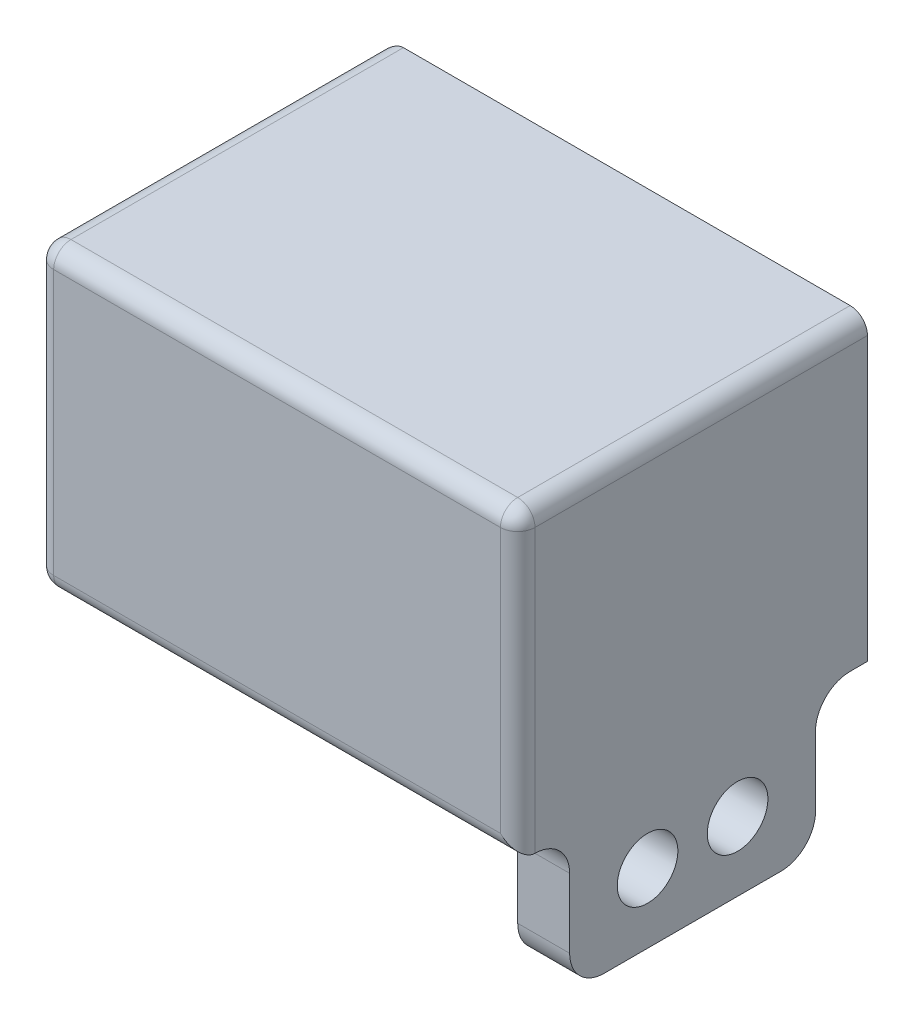
ISO-10303-21;
HEADER;
FILE_DESCRIPTION(('STEP AP214'),'2;1');
FILE_NAME('part.step','',(''),(''),'','','');
FILE_SCHEMA(('AUTOMOTIVE_DESIGN { 1 0 10303 214 1 1 1 1 }'));
ENDSEC;
DATA;
#1=APPLICATION_CONTEXT('core data for automotive mechanical design processes');
#2=APPLICATION_PROTOCOL_DEFINITION('international standard','automotive_design',2000,#1);
#3=PRODUCT_CONTEXT('',#1,'mechanical');
#4=PRODUCT('Part','Part','',(#3));
#5=PRODUCT_RELATED_PRODUCT_CATEGORY('part','',(#4));
#6=PRODUCT_DEFINITION_FORMATION('','',#4);
#7=PRODUCT_DEFINITION_CONTEXT('part definition',#1,'design');
#8=PRODUCT_DEFINITION('design','',#6,#7);
#9=PRODUCT_DEFINITION_SHAPE('','',#8);
#10=(LENGTH_UNIT() NAMED_UNIT(*) SI_UNIT(.MILLI.,.METRE.));
#11=(NAMED_UNIT(*) PLANE_ANGLE_UNIT() SI_UNIT($,.RADIAN.));
#12=(NAMED_UNIT(*) SI_UNIT($,.STERADIAN.) SOLID_ANGLE_UNIT());
#13=UNCERTAINTY_MEASURE_WITH_UNIT(LENGTH_MEASURE(1.E-05),#10,'distance_accuracy_value','');
#14=(GEOMETRIC_REPRESENTATION_CONTEXT(3) GLOBAL_UNCERTAINTY_ASSIGNED_CONTEXT((#13)) GLOBAL_UNIT_ASSIGNED_CONTEXT((#10,
#11,#12)) REPRESENTATION_CONTEXT('',''));
#15=CARTESIAN_POINT('',(0.,0.,0.));
#16=DIRECTION('',(0.,0.,1.));
#17=DIRECTION('',(1.,0.,0.));
#18=AXIS2_PLACEMENT_3D('',#15,#16,#17);
#19=CARTESIAN_POINT('',(-11.4,8.65,2.));
#20=DIRECTION('',(1.,0.,0.));
#21=DIRECTION('',(0.,1.,0.));
#22=AXIS2_PLACEMENT_3D('',#19,#20,#21);
#23=PLANE('',#22);
#24=DIRECTION('',(0.,-1.,0.));
#25=VECTOR('',#24,1.);
#26=CARTESIAN_POINT('',(-11.4,8.65,-17.2));
#27=LINE('',#26,#25);
#28=CARTESIAN_POINT('',(-11.4,7.65,-17.2));
#29=VERTEX_POINT('',#28);
#30=CARTESIAN_POINT('',(-11.4,7.15,-17.2));
#31=VERTEX_POINT('',#30);
#32=EDGE_CURVE('E368',#29,#31,#27,.T.);
#33=ORIENTED_EDGE('',*,*,#32,.T.);
#34=DIRECTION('',(0.,0.,1.));
#35=VECTOR('',#34,1.);
#36=CARTESIAN_POINT('',(-11.4,7.15,2.));
#37=LINE('',#36,#35);
#38=CARTESIAN_POINT('',(-11.4,7.15,1.));
#39=VERTEX_POINT('',#38);
#40=EDGE_CURVE('E371',#31,#39,#37,.T.);
#41=ORIENTED_EDGE('',*,*,#40,.T.);
#42=DIRECTION('',(0.,-1.,0.));
#43=VECTOR('',#42,1.);
#44=CARTESIAN_POINT('',(-11.4,8.65,1.));
#45=LINE('',#44,#43);
#46=CARTESIAN_POINT('',(-11.4,7.65,1.));
#47=VERTEX_POINT('',#46);
#48=EDGE_CURVE('E362',#39,#47,#45,.F.);
#49=ORIENTED_EDGE('',*,*,#48,.T.);
#50=DIRECTION('',(0.,0.,-1.));
#51=VECTOR('',#50,1.);
#52=CARTESIAN_POINT('',(-11.4,7.65,-18.2));
#53=LINE('',#52,#51);
#54=EDGE_CURVE('E365',#47,#29,#53,.T.);
#55=ORIENTED_EDGE('',*,*,#54,.T.);
#56=EDGE_LOOP('',(#33,#41,#49,#55));
#57=FACE_BOUND('',#56,.T.);
#58=ADVANCED_FACE('F47',(#57),#23,.F.);
#59=CARTESIAN_POINT('',(0.,0.,2.));
#60=DIRECTION('',(0.,0.,1.));
#61=DIRECTION('',(1.,0.,0.));
#62=AXIS2_PLACEMENT_3D('',#59,#60,#61);
#63=PLANE('',#62);
#64=DIRECTION('',(0.,-1.,0.));
#65=VECTOR('',#64,1.);
#66=CARTESIAN_POINT('',(-10.4,-8.65,2.));
#67=LINE('',#66,#65);
#68=CARTESIAN_POINT('',(-10.4,7.65,2.));
#69=VERTEX_POINT('',#68);
#70=CARTESIAN_POINT('',(-10.4,-7.65,2.));
#71=VERTEX_POINT('',#70);
#72=EDGE_CURVE('E332',#69,#71,#67,.T.);
#73=ORIENTED_EDGE('',*,*,#72,.T.);
#74=DIRECTION('',(1.,0.,0.));
#75=VECTOR('',#74,1.);
#76=CARTESIAN_POINT('',(0.,-7.65,2.));
#77=LINE('',#76,#75);
#78=CARTESIAN_POINT('',(15.4,-7.65,2.));
#79=VERTEX_POINT('',#78);
#80=EDGE_CURVE('E339',#71,#79,#77,.T.);
#81=ORIENTED_EDGE('',*,*,#80,.T.);
#82=DIRECTION('',(0.,1.,0.));
#83=VECTOR('',#82,1.);
#84=CARTESIAN_POINT('',(15.4,0.,2.));
#85=LINE('',#84,#83);
#86=CARTESIAN_POINT('',(15.4,7.65,2.));
#87=VERTEX_POINT('',#86);
#88=EDGE_CURVE('E335',#79,#87,#85,.T.);
#89=ORIENTED_EDGE('',*,*,#88,.T.);
#90=DIRECTION('',(-1.,0.,0.));
#91=VECTOR('',#90,1.);
#92=CARTESIAN_POINT('',(0.,7.65,2.));
#93=LINE('',#92,#91);
#94=EDGE_CURVE('E329',#87,#69,#93,.T.);
#95=ORIENTED_EDGE('',*,*,#94,.T.);
#96=EDGE_LOOP('',(#73,#81,#89,#95));
#97=FACE_BOUND('',#96,.T.);
#98=ADVANCED_FACE('F557',(#97),#63,.T.);
#99=CARTESIAN_POINT('',(11.4,6.15,-18.2));
#100=DIRECTION('',(0.,1.,0.));
#101=DIRECTION('',(0.,0.,1.));
#102=AXIS2_PLACEMENT_3D('',#99,#100,#101);
#103=PLANE('',#102);
#104=DIRECTION('',(-1.,0.,0.));
#105=VECTOR('',#104,1.);
#106=CARTESIAN_POINT('',(11.4,6.15,0.));
#107=LINE('',#106,#105);
#108=CARTESIAN_POINT('',(11.4,6.15,0.));
#109=VERTEX_POINT('',#108);
#110=CARTESIAN_POINT('',(-10.4,6.15,0.));
#111=VERTEX_POINT('',#110);
#112=EDGE_CURVE('E264',#109,#111,#107,.T.);
#113=ORIENTED_EDGE('',*,*,#112,.T.);
#114=DIRECTION('',(0.,0.,1.));
#115=VECTOR('',#114,1.);
#116=CARTESIAN_POINT('',(-10.4,6.15,-18.2));
#117=LINE('',#116,#115);
#118=CARTESIAN_POINT('',(-10.4,6.15,-18.2));
#119=VERTEX_POINT('',#118);
#120=EDGE_CURVE('E228',#111,#119,#117,.F.);
#121=ORIENTED_EDGE('',*,*,#120,.T.);
#122=DIRECTION('',(-1.,0.,0.));
#123=VECTOR('',#122,1.);
#124=CARTESIAN_POINT('',(11.4,6.15,-18.2));
#125=LINE('',#124,#123);
#126=CARTESIAN_POINT('',(11.4,6.15,-18.2));
#127=VERTEX_POINT('',#126);
#128=EDGE_CURVE('E225',#127,#119,#125,.T.);
#129=ORIENTED_EDGE('',*,*,#128,.F.);
#130=DIRECTION('',(0.,0.,1.));
#131=VECTOR('',#130,1.);
#132=CARTESIAN_POINT('',(11.4,6.15,-18.2));
#133=LINE('',#132,#131);
#134=EDGE_CURVE('E209',#127,#109,#133,.T.);
#135=ORIENTED_EDGE('',*,*,#134,.T.);
#136=EDGE_LOOP('',(#113,#121,#129,#135));
#137=FACE_BOUND('',#136,.T.);
#138=ADVANCED_FACE('F226',(#137),#103,.F.);
#139=CARTESIAN_POINT('',(11.4,-6.15,-18.2));
#140=DIRECTION('',(1.,0.,0.));
#141=DIRECTION('',(0.,0.,-1.));
#142=AXIS2_PLACEMENT_3D('',#139,#140,#141);
#143=PLANE('',#142);
#144=DIRECTION('',(0.,0.,1.));
#145=VECTOR('',#144,1.);
#146=CARTESIAN_POINT('',(11.4,-6.15,-18.2));
#147=LINE('',#146,#145);
#148=CARTESIAN_POINT('',(11.4,-6.15,-18.2));
#149=VERTEX_POINT('',#148);
#150=CARTESIAN_POINT('',(11.4,-6.15,0.));
#151=VERTEX_POINT('',#150);
#152=EDGE_CURVE('E222',#149,#151,#147,.T.);
#153=ORIENTED_EDGE('',*,*,#152,.T.);
#154=DIRECTION('',(0.,1.,0.));
#155=VECTOR('',#154,1.);
#156=CARTESIAN_POINT('',(11.4,-6.15,0.));
#157=LINE('',#156,#155);
#158=EDGE_CURVE('E217',#151,#109,#157,.T.);
#159=ORIENTED_EDGE('',*,*,#158,.T.);
#160=ORIENTED_EDGE('',*,*,#134,.F.);
#161=DIRECTION('',(0.,1.,0.));
#162=VECTOR('',#161,1.);
#163=CARTESIAN_POINT('',(11.4,-6.15,-18.2));
#164=LINE('',#163,#162);
#165=EDGE_CURVE('E214',#149,#127,#164,.T.);
#166=ORIENTED_EDGE('',*,*,#165,.F.);
#167=EDGE_LOOP('',(#153,#159,#160,#166));
#168=FACE_BOUND('',#167,.T.);
#169=ADVANCED_FACE('F212',(#168),#143,.F.);
#170=CARTESIAN_POINT('',(11.4,-6.15,-18.2));
#171=DIRECTION('',(0.,-1.,0.));
#172=DIRECTION('',(0.,0.,-1.));
#173=AXIS2_PLACEMENT_3D('',#170,#171,#172);
#174=PLANE('',#173);
#175=DIRECTION('',(1.,0.,0.));
#176=VECTOR('',#175,1.);
#177=CARTESIAN_POINT('',(11.4,-6.15,-18.2));
#178=LINE('',#177,#176);
#179=CARTESIAN_POINT('',(-10.4,-6.15,-18.2));
#180=VERTEX_POINT('',#179);
#181=EDGE_CURVE('E235',#180,#149,#178,.T.);
#182=ORIENTED_EDGE('',*,*,#181,.F.);
#183=DIRECTION('',(0.,0.,1.));
#184=VECTOR('',#183,1.);
#185=CARTESIAN_POINT('',(-10.4,-6.15,-18.2));
#186=LINE('',#185,#184);
#187=CARTESIAN_POINT('',(-10.4,-6.15,0.));
#188=VERTEX_POINT('',#187);
#189=EDGE_CURVE('E395',#180,#188,#186,.T.);
#190=ORIENTED_EDGE('',*,*,#189,.T.);
#191=DIRECTION('',(1.,0.,0.));
#192=VECTOR('',#191,1.);
#193=CARTESIAN_POINT('',(11.4,-6.15,0.));
#194=LINE('',#193,#192);
#195=EDGE_CURVE('E259',#188,#151,#194,.T.);
#196=ORIENTED_EDGE('',*,*,#195,.T.);
#197=ORIENTED_EDGE('',*,*,#152,.F.);
#198=EDGE_LOOP('',(#182,#190,#196,#197));
#199=FACE_BOUND('',#198,.T.);
#200=ADVANCED_FACE('F601',(#199),#174,.F.);
#201=CARTESIAN_POINT('',(16.4,8.65,-18.2));
#202=DIRECTION('',(0.,1.,0.));
#203=DIRECTION('',(0.,0.,1.));
#204=AXIS2_PLACEMENT_3D('',#201,#202,#203);
#205=PLANE('',#204);
#206=DIRECTION('',(-1.,0.,0.));
#207=VECTOR('',#206,1.);
#208=CARTESIAN_POINT('',(16.4,8.65,-18.2));
#209=LINE('',#208,#207);
#210=CARTESIAN_POINT('',(15.4,8.65,-18.2));
#211=VERTEX_POINT('',#210);
#212=CARTESIAN_POINT('',(-10.4,8.65,-18.2));
#213=VERTEX_POINT('',#212);
#214=EDGE_CURVE('E251',#211,#213,#209,.T.);
#215=ORIENTED_EDGE('',*,*,#214,.T.);
#216=DIRECTION('',(0.,0.,-1.));
#217=VECTOR('',#216,1.);
#218=CARTESIAN_POINT('',(-10.4,8.65,2.));
#219=LINE('',#218,#217);
#220=CARTESIAN_POINT('',(-10.4,8.65,1.));
#221=VERTEX_POINT('',#220);
#222=EDGE_CURVE('E386',#213,#221,#219,.F.);
#223=ORIENTED_EDGE('',*,*,#222,.T.);
#224=DIRECTION('',(-1.,0.,0.));
#225=VECTOR('',#224,1.);
#226=CARTESIAN_POINT('',(16.4,8.65,1.));
#227=LINE('',#226,#225);
#228=CARTESIAN_POINT('',(15.4,8.65,1.));
#229=VERTEX_POINT('',#228);
#230=EDGE_CURVE('E383',#221,#229,#227,.F.);
#231=ORIENTED_EDGE('',*,*,#230,.T.);
#232=DIRECTION('',(0.,0.,1.));
#233=VECTOR('',#232,1.);
#234=CARTESIAN_POINT('',(15.4,8.65,-18.2));
#235=LINE('',#234,#233);
#236=EDGE_CURVE('E270',#229,#211,#235,.F.);
#237=ORIENTED_EDGE('',*,*,#236,.T.);
#238=EDGE_LOOP('',(#215,#223,#231,#237));
#239=FACE_BOUND('',#238,.T.);
#240=ADVANCED_FACE('F604',(#239),#205,.T.);
#241=CARTESIAN_POINT('',(16.4,-8.65,-18.2));
#242=DIRECTION('',(1.,0.,0.));
#243=DIRECTION('',(0.,0.,-1.));
#244=AXIS2_PLACEMENT_3D('',#241,#242,#243);
#245=PLANE('',#244);
#246=CARTESIAN_POINT('',(16.4,-12.65,-10.7));
#247=DIRECTION('',(-1.,0.,0.));
#248=DIRECTION('',(0.,0.,1.));
#249=AXIS2_PLACEMENT_3D('',#246,#247,#248);
#250=CIRCLE('',#249,1.75);
#251=CARTESIAN_POINT('',(16.4,-12.65,-8.95));
#252=VERTEX_POINT('',#251);
#253=EDGE_CURVE('E695',#252,#252,#250,.T.);
#254=ORIENTED_EDGE('',*,*,#253,.T.);
#255=EDGE_LOOP('',(#254));
#256=FACE_BOUND('',#255,.T.);
#257=CARTESIAN_POINT('',(16.4,-12.65,-5.5));
#258=DIRECTION('',(-1.,0.,0.));
#259=DIRECTION('',(0.,0.,1.));
#260=AXIS2_PLACEMENT_3D('',#257,#258,#259);
#261=CIRCLE('',#260,1.75);
#262=CARTESIAN_POINT('',(16.4,-12.65,-3.75));
#263=VERTEX_POINT('',#262);
#264=EDGE_CURVE('E463',#263,#263,#261,.T.);
#265=ORIENTED_EDGE('',*,*,#264,.T.);
#266=EDGE_LOOP('',(#265));
#267=FACE_BOUND('',#266,.T.);
#268=DIRECTION('',(0.,0.,1.));
#269=VECTOR('',#268,1.);
#270=CARTESIAN_POINT('',(16.4,7.65,-18.2));
#271=LINE('',#270,#269);
#272=CARTESIAN_POINT('',(16.4,7.65,-18.2));
#273=VERTEX_POINT('',#272);
#274=CARTESIAN_POINT('',(16.4,7.65,1.));
#275=VERTEX_POINT('',#274);
#276=EDGE_CURVE('E273',#273,#275,#271,.T.);
#277=ORIENTED_EDGE('',*,*,#276,.T.);
#278=DIRECTION('',(0.,1.,0.));
#279=VECTOR('',#278,1.);
#280=CARTESIAN_POINT('',(16.4,-8.65,1.));
#281=LINE('',#280,#279);
#282=CARTESIAN_POINT('',(16.4,-8.65,1.));
#283=VERTEX_POINT('',#282);
#284=EDGE_CURVE('E342',#275,#283,#281,.F.);
#285=ORIENTED_EDGE('',*,*,#284,.T.);
#286=CARTESIAN_POINT('',(16.4,-10.65,1.));
#287=DIRECTION('',(1.,0.,0.));
#288=DIRECTION('',(0.,0.,-1.));
#289=AXIS2_PLACEMENT_3D('',#286,#287,#288);
#290=CIRCLE('',#289,2.);
#291=CARTESIAN_POINT('',(16.4,-10.65,-1.));
#292=VERTEX_POINT('',#291);
#293=EDGE_CURVE('E317',#283,#292,#290,.F.);
#294=ORIENTED_EDGE('',*,*,#293,.T.);
#295=DIRECTION('',(0.,-1.,0.));
#296=VECTOR('',#295,1.);
#297=CARTESIAN_POINT('',(16.4,-8.65,-1.));
#298=LINE('',#297,#296);
#299=CARTESIAN_POINT('',(16.4,-14.65,-1.));
#300=VERTEX_POINT('',#299);
#301=EDGE_CURVE('E690',#292,#300,#298,.T.);
#302=ORIENTED_EDGE('',*,*,#301,.T.);
#303=CARTESIAN_POINT('',(16.4,-14.65,-3.));
#304=DIRECTION('',(1.,0.,0.));
#305=DIRECTION('',(0.,0.,-1.));
#306=AXIS2_PLACEMENT_3D('',#303,#304,#305);
#307=CIRCLE('',#306,2.);
#308=CARTESIAN_POINT('',(16.4,-16.65,-3.));
#309=VERTEX_POINT('',#308);
#310=EDGE_CURVE('E294',#300,#309,#307,.T.);
#311=ORIENTED_EDGE('',*,*,#310,.T.);
#312=DIRECTION('',(0.,0.,-1.));
#313=VECTOR('',#312,1.);
#314=CARTESIAN_POINT('',(16.4,-16.65,-1.));
#315=LINE('',#314,#313);
#316=CARTESIAN_POINT('',(16.4,-16.65,-13.2));
#317=VERTEX_POINT('',#316);
#318=EDGE_CURVE('E694',#309,#317,#315,.T.);
#319=ORIENTED_EDGE('',*,*,#318,.T.);
#320=CARTESIAN_POINT('',(16.4,-14.65,-13.2));
#321=DIRECTION('',(1.,0.,0.));
#322=DIRECTION('',(0.,0.,-1.));
#323=AXIS2_PLACEMENT_3D('',#320,#321,#322);
#324=CIRCLE('',#323,2.);
#325=CARTESIAN_POINT('',(16.4,-14.65,-15.2));
#326=VERTEX_POINT('',#325);
#327=EDGE_CURVE('E291',#317,#326,#324,.T.);
#328=ORIENTED_EDGE('',*,*,#327,.T.);
#329=DIRECTION('',(0.,1.,0.));
#330=VECTOR('',#329,1.);
#331=CARTESIAN_POINT('',(16.4,-8.65,-15.2));
#332=LINE('',#331,#330);
#333=CARTESIAN_POINT('',(16.4,-10.65,-15.2));
#334=VERTEX_POINT('',#333);
#335=EDGE_CURVE('E699',#326,#334,#332,.T.);
#336=ORIENTED_EDGE('',*,*,#335,.T.);
#337=CARTESIAN_POINT('',(16.4,-10.65,-17.2));
#338=DIRECTION('',(1.,0.,0.));
#339=DIRECTION('',(0.,0.,-1.));
#340=AXIS2_PLACEMENT_3D('',#337,#338,#339);
#341=CIRCLE('',#340,2.);
#342=CARTESIAN_POINT('',(16.4,-8.65,-17.2));
#343=VERTEX_POINT('',#342);
#344=EDGE_CURVE('E323',#334,#343,#341,.F.);
#345=ORIENTED_EDGE('',*,*,#344,.T.);
#346=DIRECTION('',(0.,0.,1.));
#347=VECTOR('',#346,1.);
#348=CARTESIAN_POINT('',(16.4,-8.65,-18.2));
#349=LINE('',#348,#347);
#350=CARTESIAN_POINT('',(16.4,-8.65,-18.2));
#351=VERTEX_POINT('',#350);
#352=EDGE_CURVE('E255',#351,#343,#349,.T.);
#353=ORIENTED_EDGE('',*,*,#352,.F.);
#354=DIRECTION('',(0.,1.,0.));
#355=VECTOR('',#354,1.);
#356=CARTESIAN_POINT('',(16.4,-8.65,-18.2));
#357=LINE('',#356,#355);
#358=EDGE_CURVE('E247',#351,#273,#357,.T.);
#359=ORIENTED_EDGE('',*,*,#358,.T.);
#360=EDGE_LOOP('',(#277,#285,#294,#302,#311,#319,#328,#336,#345,#353,#359));
#361=FACE_BOUND('',#360,.T.);
#362=ADVANCED_FACE('F612',(#256,#267,#361),#245,.T.);
#363=CARTESIAN_POINT('',(16.4,-8.65,-18.2));
#364=DIRECTION('',(0.,-1.,0.));
#365=DIRECTION('',(0.,0.,-1.));
#366=AXIS2_PLACEMENT_3D('',#363,#364,#365);
#367=PLANE('',#366);
#368=DIRECTION('',(1.,0.,0.));
#369=VECTOR('',#368,1.);
#370=CARTESIAN_POINT('',(13.4,-8.65,-17.2));
#371=LINE('',#370,#369);
#372=CARTESIAN_POINT('',(12.4,-8.65,-17.2));
#373=VERTEX_POINT('',#372);
#374=EDGE_CURVE('E277',#343,#373,#371,.F.);
#375=ORIENTED_EDGE('',*,*,#374,.T.);
#376=DIRECTION('',(0.,0.,1.));
#377=VECTOR('',#376,1.);
#378=CARTESIAN_POINT('',(12.4,-8.65,-18.2));
#379=LINE('',#378,#377);
#380=CARTESIAN_POINT('',(12.4,-8.65,1.));
#381=VERTEX_POINT('',#380);
#382=EDGE_CURVE('E401',#373,#381,#379,.T.);
#383=ORIENTED_EDGE('',*,*,#382,.T.);
#384=DIRECTION('',(1.,0.,0.));
#385=VECTOR('',#384,1.);
#386=CARTESIAN_POINT('',(16.4,-8.65,1.));
#387=LINE('',#386,#385);
#388=CARTESIAN_POINT('',(-10.4,-8.65,1.));
#389=VERTEX_POINT('',#388);
#390=EDGE_CURVE('E389',#381,#389,#387,.F.);
#391=ORIENTED_EDGE('',*,*,#390,.T.);
#392=DIRECTION('',(0.,0.,-1.));
#393=VECTOR('',#392,1.);
#394=CARTESIAN_POINT('',(-10.4,-8.65,-18.2));
#395=LINE('',#394,#393);
#396=CARTESIAN_POINT('',(-10.4,-8.65,-18.2));
#397=VERTEX_POINT('',#396);
#398=EDGE_CURVE('E392',#389,#397,#395,.T.);
#399=ORIENTED_EDGE('',*,*,#398,.T.);
#400=DIRECTION('',(1.,0.,0.));
#401=VECTOR('',#400,1.);
#402=CARTESIAN_POINT('',(16.4,-8.65,-18.2));
#403=LINE('',#402,#401);
#404=EDGE_CURVE('E221',#397,#351,#403,.T.);
#405=ORIENTED_EDGE('',*,*,#404,.T.);
#406=ORIENTED_EDGE('',*,*,#352,.T.);
#407=EDGE_LOOP('',(#375,#383,#391,#399,#405,#406));
#408=FACE_BOUND('',#407,.T.);
#409=ADVANCED_FACE('F608',(#408),#367,.T.);
#410=CARTESIAN_POINT('',(0.,0.,-18.2));
#411=DIRECTION('',(0.,0.,1.));
#412=DIRECTION('',(1.,0.,0.));
#413=AXIS2_PLACEMENT_3D('',#410,#411,#412);
#414=PLANE('',#413);
#415=CARTESIAN_POINT('',(13.75,0.,-18.2));
#416=DIRECTION('',(0.,0.,-1.));
#417=DIRECTION('',(-1.,0.,0.));
#418=AXIS2_PLACEMENT_3D('',#415,#416,#417);
#419=CIRCLE('',#418,0.75);
#420=CARTESIAN_POINT('',(13.,0.,-18.2));
#421=VERTEX_POINT('',#420);
#422=EDGE_CURVE('E679',#421,#421,#419,.T.);
#423=ORIENTED_EDGE('',*,*,#422,.F.);
#424=EDGE_LOOP('',(#423));
#425=FACE_BOUND('',#424,.T.);
#426=ORIENTED_EDGE('',*,*,#128,.T.);
#427=DIRECTION('',(0.,-1.,0.));
#428=VECTOR('',#427,1.);
#429=CARTESIAN_POINT('',(-10.4,0.,-18.2));
#430=LINE('',#429,#428);
#431=EDGE_CURVE('E380',#119,#213,#430,.F.);
#432=ORIENTED_EDGE('',*,*,#431,.T.);
#433=ORIENTED_EDGE('',*,*,#214,.F.);
#434=CARTESIAN_POINT('',(15.4,7.65,-18.2));
#435=DIRECTION('',(0.,0.,1.));
#436=DIRECTION('',(1.,0.,0.));
#437=AXIS2_PLACEMENT_3D('',#434,#435,#436);
#438=CIRCLE('',#437,1.);
#439=EDGE_CURVE('E267',#211,#273,#438,.F.);
#440=ORIENTED_EDGE('',*,*,#439,.T.);
#441=ORIENTED_EDGE('',*,*,#358,.F.);
#442=ORIENTED_EDGE('',*,*,#404,.F.);
#443=DIRECTION('',(0.,-1.,0.));
#444=VECTOR('',#443,1.);
#445=CARTESIAN_POINT('',(-10.4,0.,-18.2));
#446=LINE('',#445,#444);
#447=EDGE_CURVE('E377',#397,#180,#446,.F.);
#448=ORIENTED_EDGE('',*,*,#447,.T.);
#449=ORIENTED_EDGE('',*,*,#181,.T.);
#450=ORIENTED_EDGE('',*,*,#165,.T.);
#451=EDGE_LOOP('',(#426,#432,#433,#440,#441,#442,#448,#449,#450));
#452=FACE_BOUND('',#451,.T.);
#453=ADVANCED_FACE('F233',(#425,#452),#414,.F.);
#454=CARTESIAN_POINT('',(0.,0.,0.));
#455=DIRECTION('',(0.,0.,1.));
#456=DIRECTION('',(1.,0.,0.));
#457=AXIS2_PLACEMENT_3D('',#454,#455,#456);
#458=PLANE('',#457);
#459=ORIENTED_EDGE('',*,*,#195,.F.);
#460=DIRECTION('',(0.,-1.,0.));
#461=VECTOR('',#460,1.);
#462=CARTESIAN_POINT('',(-10.4,0.,0.));
#463=LINE('',#462,#461);
#464=EDGE_CURVE('E398',#188,#111,#463,.F.);
#465=ORIENTED_EDGE('',*,*,#464,.T.);
#466=ORIENTED_EDGE('',*,*,#112,.F.);
#467=ORIENTED_EDGE('',*,*,#158,.F.);
#468=EDGE_LOOP('',(#459,#465,#466,#467));
#469=FACE_BOUND('',#468,.T.);
#470=ADVANCED_FACE('F595',(#469),#458,.F.);
#471=CARTESIAN_POINT('',(13.75,0.,-13.2));
#472=DIRECTION('',(0.,0.,-1.));
#473=DIRECTION('',(-1.,0.,0.));
#474=AXIS2_PLACEMENT_3D('',#471,#472,#473);
#475=CYLINDRICAL_SURFACE('',#474,0.75);
#476=CARTESIAN_POINT('',(13.75,0.,-13.2));
#477=DIRECTION('',(0.,0.,-1.));
#478=DIRECTION('',(-1.,0.,0.));
#479=AXIS2_PLACEMENT_3D('',#476,#477,#478);
#480=CIRCLE('',#479,0.75);
#481=CARTESIAN_POINT('',(13.,0.,-13.2));
#482=VERTEX_POINT('',#481);
#483=EDGE_CURVE('E239',#482,#482,#480,.T.);
#484=ORIENTED_EDGE('',*,*,#483,.F.);
#485=EDGE_LOOP('',(#484));
#486=FACE_BOUND('',#485,.T.);
#487=ORIENTED_EDGE('',*,*,#422,.T.);
#488=EDGE_LOOP('',(#487));
#489=FACE_BOUND('',#488,.T.);
#490=ADVANCED_FACE('F591',(#486,#489),#475,.F.);
#491=CARTESIAN_POINT('',(13.75,0.,-13.2));
#492=DIRECTION('',(0.,0.,-1.));
#493=DIRECTION('',(-1.,0.,0.));
#494=AXIS2_PLACEMENT_3D('',#491,#492,#493);
#495=PLANE('',#494);
#496=ORIENTED_EDGE('',*,*,#483,.T.);
#497=EDGE_LOOP('',(#496));
#498=FACE_BOUND('',#497,.T.);
#499=ADVANCED_FACE('F588',(#498),#495,.T.);
#500=CARTESIAN_POINT('',(15.4,7.65,-18.2));
#501=DIRECTION('',(0.,0.,1.));
#502=DIRECTION('',(1.,0.,0.));
#503=AXIS2_PLACEMENT_3D('',#500,#501,#502);
#504=CYLINDRICAL_SURFACE('',#503,1.);
#505=ORIENTED_EDGE('',*,*,#236,.F.);
#506=CARTESIAN_POINT('',(15.4,7.65,1.));
#507=DIRECTION('',(0.,0.,1.));
#508=DIRECTION('',(1.,0.,0.));
#509=AXIS2_PLACEMENT_3D('',#506,#507,#508);
#510=CIRCLE('',#509,1.);
#511=EDGE_CURVE('E346',#229,#275,#510,.F.);
#512=ORIENTED_EDGE('',*,*,#511,.T.);
#513=ORIENTED_EDGE('',*,*,#276,.F.);
#514=ORIENTED_EDGE('',*,*,#439,.F.);
#515=EDGE_LOOP('',(#505,#512,#513,#514));
#516=FACE_BOUND('',#515,.T.);
#517=ADVANCED_FACE('F482',(#516),#504,.T.);
#518=CARTESIAN_POINT('',(13.4,-8.65,-1.));
#519=DIRECTION('',(0.,0.,1.));
#520=DIRECTION('',(0.,-1.,0.));
#521=AXIS2_PLACEMENT_3D('',#518,#519,#520);
#522=PLANE('',#521);
#523=ORIENTED_EDGE('',*,*,#301,.F.);
#524=DIRECTION('',(1.,0.,0.));
#525=VECTOR('',#524,1.);
#526=CARTESIAN_POINT('',(13.4,-10.65,-1.));
#527=LINE('',#526,#525);
#528=CARTESIAN_POINT('',(13.4,-10.65,-1.));
#529=VERTEX_POINT('',#528);
#530=EDGE_CURVE('E288',#292,#529,#527,.F.);
#531=ORIENTED_EDGE('',*,*,#530,.T.);
#532=DIRECTION('',(0.,-1.,0.));
#533=VECTOR('',#532,1.);
#534=CARTESIAN_POINT('',(13.4,-8.65,-1.));
#535=LINE('',#534,#533);
#536=CARTESIAN_POINT('',(13.4,-14.65,-1.));
#537=VERTEX_POINT('',#536);
#538=EDGE_CURVE('E686',#529,#537,#535,.T.);
#539=ORIENTED_EDGE('',*,*,#538,.T.);
#540=DIRECTION('',(1.,0.,0.));
#541=VECTOR('',#540,1.);
#542=CARTESIAN_POINT('',(13.4,-14.65,-1.));
#543=LINE('',#542,#541);
#544=EDGE_CURVE('E284',#537,#300,#543,.T.);
#545=ORIENTED_EDGE('',*,*,#544,.T.);
#546=EDGE_LOOP('',(#523,#531,#539,#545));
#547=FACE_BOUND('',#546,.T.);
#548=ADVANCED_FACE('F580',(#547),#522,.T.);
#549=CARTESIAN_POINT('',(13.4,-8.65,-15.2));
#550=DIRECTION('',(0.,0.,-1.));
#551=DIRECTION('',(0.,1.,0.));
#552=AXIS2_PLACEMENT_3D('',#549,#550,#551);
#553=PLANE('',#552);
#554=ORIENTED_EDGE('',*,*,#335,.F.);
#555=DIRECTION('',(1.,0.,0.));
#556=VECTOR('',#555,1.);
#557=CARTESIAN_POINT('',(13.4,-14.65,-15.2));
#558=LINE('',#557,#556);
#559=CARTESIAN_POINT('',(13.4,-14.65,-15.2));
#560=VERTEX_POINT('',#559);
#561=EDGE_CURVE('E314',#326,#560,#558,.F.);
#562=ORIENTED_EDGE('',*,*,#561,.T.);
#563=DIRECTION('',(0.,1.,0.));
#564=VECTOR('',#563,1.);
#565=CARTESIAN_POINT('',(13.4,-8.65,-15.2));
#566=LINE('',#565,#564);
#567=CARTESIAN_POINT('',(13.4,-10.65,-15.2));
#568=VERTEX_POINT('',#567);
#569=EDGE_CURVE('E673',#560,#568,#566,.T.);
#570=ORIENTED_EDGE('',*,*,#569,.T.);
#571=DIRECTION('',(1.,0.,0.));
#572=VECTOR('',#571,1.);
#573=CARTESIAN_POINT('',(16.4,-10.65,-15.2));
#574=LINE('',#573,#572);
#575=EDGE_CURVE('E310',#568,#334,#574,.T.);
#576=ORIENTED_EDGE('',*,*,#575,.T.);
#577=EDGE_LOOP('',(#554,#562,#570,#576));
#578=FACE_BOUND('',#577,.T.);
#579=ADVANCED_FACE('F577',(#578),#553,.T.);
#580=CARTESIAN_POINT('',(13.4,-16.65,-1.));
#581=DIRECTION('',(0.,-1.,0.));
#582=DIRECTION('',(0.,0.,-1.));
#583=AXIS2_PLACEMENT_3D('',#580,#581,#582);
#584=PLANE('',#583);
#585=ORIENTED_EDGE('',*,*,#318,.F.);
#586=DIRECTION('',(1.,0.,0.));
#587=VECTOR('',#586,1.);
#588=CARTESIAN_POINT('',(13.4,-16.65,-3.));
#589=LINE('',#588,#587);
#590=CARTESIAN_POINT('',(13.4,-16.65,-3.));
#591=VERTEX_POINT('',#590);
#592=EDGE_CURVE('E301',#309,#591,#589,.F.);
#593=ORIENTED_EDGE('',*,*,#592,.T.);
#594=DIRECTION('',(0.,0.,-1.));
#595=VECTOR('',#594,1.);
#596=CARTESIAN_POINT('',(13.4,-16.65,-1.));
#597=LINE('',#596,#595);
#598=CARTESIAN_POINT('',(13.4,-16.65,-13.2));
#599=VERTEX_POINT('',#598);
#600=EDGE_CURVE('E680',#591,#599,#597,.T.);
#601=ORIENTED_EDGE('',*,*,#600,.T.);
#602=DIRECTION('',(1.,0.,0.));
#603=VECTOR('',#602,1.);
#604=CARTESIAN_POINT('',(13.4,-16.65,-13.2));
#605=LINE('',#604,#603);
#606=EDGE_CURVE('E297',#599,#317,#605,.T.);
#607=ORIENTED_EDGE('',*,*,#606,.T.);
#608=EDGE_LOOP('',(#585,#593,#601,#607));
#609=FACE_BOUND('',#608,.T.);
#610=ADVANCED_FACE('F575',(#609),#584,.T.);
#611=CARTESIAN_POINT('',(13.4,0.,0.));
#612=DIRECTION('',(1.,0.,0.));
#613=DIRECTION('',(0.,0.,-1.));
#614=AXIS2_PLACEMENT_3D('',#611,#612,#613);
#615=PLANE('',#614);
#616=CARTESIAN_POINT('',(13.4,-12.65,-10.7));
#617=DIRECTION('',(-1.,0.,0.));
#618=DIRECTION('',(0.,0.,1.));
#619=AXIS2_PLACEMENT_3D('',#616,#617,#618);
#620=CIRCLE('',#619,1.75);
#621=CARTESIAN_POINT('',(13.4,-12.65,-8.95));
#622=VERTEX_POINT('',#621);
#623=EDGE_CURVE('E719',#622,#622,#620,.T.);
#624=ORIENTED_EDGE('',*,*,#623,.F.);
#625=EDGE_LOOP('',(#624));
#626=FACE_BOUND('',#625,.T.);
#627=CARTESIAN_POINT('',(13.4,-12.65,-5.5));
#628=DIRECTION('',(-1.,0.,0.));
#629=DIRECTION('',(0.,0.,1.));
#630=AXIS2_PLACEMENT_3D('',#627,#628,#629);
#631=CIRCLE('',#630,1.75);
#632=CARTESIAN_POINT('',(13.4,-12.65,-3.75));
#633=VERTEX_POINT('',#632);
#634=EDGE_CURVE('E715',#633,#633,#631,.T.);
#635=ORIENTED_EDGE('',*,*,#634,.F.);
#636=EDGE_LOOP('',(#635));
#637=FACE_BOUND('',#636,.T.);
#638=CARTESIAN_POINT('',(13.4,-10.65,1.));
#639=DIRECTION('',(1.,0.,0.));
#640=DIRECTION('',(0.,0.,-1.));
#641=AXIS2_PLACEMENT_3D('',#638,#639,#640);
#642=CIRCLE('',#641,2.);
#643=CARTESIAN_POINT('',(13.4,-9.65,-0.732050807568876));
#644=VERTEX_POINT('',#643);
#645=EDGE_CURVE('E320',#529,#644,#642,.T.);
#646=ORIENTED_EDGE('',*,*,#645,.T.);
#647=DIRECTION('',(0.,0.,1.));
#648=VECTOR('',#647,1.);
#649=CARTESIAN_POINT('',(13.4,-9.65,0.));
#650=LINE('',#649,#648);
#651=CARTESIAN_POINT('',(13.4,-9.65,-15.4679491924311));
#652=VERTEX_POINT('',#651);
#653=EDGE_CURVE('E70',#644,#652,#650,.F.);
#654=ORIENTED_EDGE('',*,*,#653,.T.);
#655=CARTESIAN_POINT('',(13.4,-10.65,-17.2));
#656=DIRECTION('',(1.,0.,0.));
#657=DIRECTION('',(0.,0.,-1.));
#658=AXIS2_PLACEMENT_3D('',#655,#656,#657);
#659=CIRCLE('',#658,2.);
#660=EDGE_CURVE('E326',#652,#568,#659,.T.);
#661=ORIENTED_EDGE('',*,*,#660,.T.);
#662=ORIENTED_EDGE('',*,*,#569,.F.);
#663=CARTESIAN_POINT('',(13.4,-14.65,-13.2));
#664=DIRECTION('',(1.,0.,0.));
#665=DIRECTION('',(0.,0.,-1.));
#666=AXIS2_PLACEMENT_3D('',#663,#664,#665);
#667=CIRCLE('',#666,2.);
#668=EDGE_CURVE('E304',#560,#599,#667,.F.);
#669=ORIENTED_EDGE('',*,*,#668,.T.);
#670=ORIENTED_EDGE('',*,*,#600,.F.);
#671=CARTESIAN_POINT('',(13.4,-14.65,-3.));
#672=DIRECTION('',(1.,0.,0.));
#673=DIRECTION('',(0.,0.,-1.));
#674=AXIS2_PLACEMENT_3D('',#671,#672,#673);
#675=CIRCLE('',#674,2.);
#676=EDGE_CURVE('E307',#591,#537,#675,.F.);
#677=ORIENTED_EDGE('',*,*,#676,.T.);
#678=ORIENTED_EDGE('',*,*,#538,.F.);
#679=EDGE_LOOP('',(#646,#654,#661,#662,#669,#670,#677,#678));
#680=FACE_BOUND('',#679,.T.);
#681=ADVANCED_FACE('F571',(#626,#637,#680),#615,.F.);
#682=CARTESIAN_POINT('',(16.4,-12.65,-5.5));
#683=DIRECTION('',(-1.,0.,0.));
#684=DIRECTION('',(0.,0.,1.));
#685=AXIS2_PLACEMENT_3D('',#682,#683,#684);
#686=CYLINDRICAL_SURFACE('',#685,1.75);
#687=ORIENTED_EDGE('',*,*,#264,.F.);
#688=EDGE_LOOP('',(#687));
#689=FACE_BOUND('',#688,.T.);
#690=ORIENTED_EDGE('',*,*,#634,.T.);
#691=EDGE_LOOP('',(#690));
#692=FACE_BOUND('',#691,.T.);
#693=ADVANCED_FACE('F567',(#689,#692),#686,.F.);
#694=CARTESIAN_POINT('',(16.4,-12.65,-10.7));
#695=DIRECTION('',(-1.,0.,0.));
#696=DIRECTION('',(0.,0.,1.));
#697=AXIS2_PLACEMENT_3D('',#694,#695,#696);
#698=CYLINDRICAL_SURFACE('',#697,1.75);
#699=ORIENTED_EDGE('',*,*,#253,.F.);
#700=EDGE_LOOP('',(#699));
#701=FACE_BOUND('',#700,.T.);
#702=ORIENTED_EDGE('',*,*,#623,.T.);
#703=EDGE_LOOP('',(#702));
#704=FACE_BOUND('',#703,.T.);
#705=ADVANCED_FACE('F480',(#701,#704),#698,.F.);
#706=CARTESIAN_POINT('',(16.4,-10.65,1.));
#707=DIRECTION('',(-1.,0.,0.));
#708=DIRECTION('',(0.,0.,1.));
#709=AXIS2_PLACEMENT_3D('',#706,#707,#708);
#710=CYLINDRICAL_SURFACE('',#709,2.);
#711=ORIENTED_EDGE('',*,*,#645,.F.);
#712=ORIENTED_EDGE('',*,*,#530,.F.);
#713=ORIENTED_EDGE('',*,*,#293,.F.);
#714=DIRECTION('',(1.,0.,0.));
#715=VECTOR('',#714,1.);
#716=CARTESIAN_POINT('',(16.4,-8.65,1.));
#717=LINE('',#716,#715);
#718=EDGE_CURVE('E280',#381,#283,#717,.T.);
#719=ORIENTED_EDGE('',*,*,#718,.F.);
#720=CARTESIAN_POINT('',(13.4,-9.65,-0.732050807568876));
#721=CARTESIAN_POINT('',(13.4000001943117,-9.61254044047365,-0.710438809223163));
#722=CARTESIAN_POINT('',(13.397896802038,-9.57583917864711,-0.687615038016851));
#723=CARTESIAN_POINT('',(13.3899865923574,-9.5043435632005,-0.63990827899371));
#724=CARTESIAN_POINT('',(13.3841891596109,-9.46954461931415,-0.61503064798419));
#725=CARTESIAN_POINT('',(13.3694876408038,-9.40249844515593,-0.563809598644398));
#726=CARTESIAN_POINT('',(13.3606257301576,-9.3702235168443,-0.537489965955235));
#727=CARTESIAN_POINT('',(13.3402147841779,-9.30783971793181,-0.483345614158609));
#728=CARTESIAN_POINT('',(13.3286637685734,-9.27773246511538,-0.455519797535711));
#729=CARTESIAN_POINT('',(13.2857672324894,-9.17980188192176,-0.359353150790653));
#730=CARTESIAN_POINT('',(13.2490784965749,-9.11717437431734,-0.28801934886695));
#731=CARTESIAN_POINT('',(13.1668123316059,-9.00431082904296,-0.14036373947806));
#732=CARTESIAN_POINT('',(13.1211824117843,-8.95415214096291,-0.064014337699767));
#733=CARTESIAN_POINT('',(13.0043345955444,-8.84794475890171,0.123399272917625));
#734=CARTESIAN_POINT('',(12.9302418443284,-8.7977495749302,0.235990639775782));
#735=CARTESIAN_POINT('',(12.7760206050466,-8.71936277484821,0.464101288827329));
#736=CARTESIAN_POINT('',(12.6959000659378,-8.69114271871491,0.57961658619763));
#737=CARTESIAN_POINT('',(12.5453164388505,-8.6580907303003,0.794471740186123));
#738=CARTESIAN_POINT('',(12.4752177476519,-8.65037489576332,0.893625572060592));
#739=CARTESIAN_POINT('',(12.4034426161151,-8.65000444910876,0.995131404921642));
#740=CARTESIAN_POINT('',(12.4017212871694,-8.65000000518405,0.997565731511315));
#741=CARTESIAN_POINT('',(12.4,-8.65,1.));
#742=B_SPLINE_CURVE_WITH_KNOTS('',3,(#720,#721,#722,#723,#724,#725,#726,#727,#728,#729,#730,
#731,#732,#733,#734,#735,#736,#737,#738,#739,#740,#741),.UNSPECIFIED.,.F.,.F.,(4,2,2,2,2,2,2,2,
2,2,4),(0.,0.129592295294571,0.258856668652753,0.386408509268398,0.514054578529991,
0.817592410147235,1.1229686971365,1.55212503753216,1.98072504008937,2.34472916750578,
2.35367344935465),.UNSPECIFIED.);
#743=EDGE_CURVE('E63',#381,#644,#742,.F.);
#744=ORIENTED_EDGE('',*,*,#743,.T.);
#745=EDGE_LOOP('',(#711,#712,#713,#719,#744));
#746=FACE_BOUND('',#745,.T.);
#747=ADVANCED_FACE('F474',(#746),#710,.F.);
#748=CARTESIAN_POINT('',(13.4,-14.65,-3.));
#749=DIRECTION('',(1.,0.,0.));
#750=DIRECTION('',(0.,0.,-1.));
#751=AXIS2_PLACEMENT_3D('',#748,#749,#750);
#752=CYLINDRICAL_SURFACE('',#751,2.);
#753=ORIENTED_EDGE('',*,*,#676,.F.);
#754=ORIENTED_EDGE('',*,*,#592,.F.);
#755=ORIENTED_EDGE('',*,*,#310,.F.);
#756=ORIENTED_EDGE('',*,*,#544,.F.);
#757=EDGE_LOOP('',(#753,#754,#755,#756));
#758=FACE_BOUND('',#757,.T.);
#759=ADVANCED_FACE('F479',(#758),#752,.T.);
#760=CARTESIAN_POINT('',(13.4,-14.65,-13.2));
#761=DIRECTION('',(1.,0.,0.));
#762=DIRECTION('',(0.,0.,-1.));
#763=AXIS2_PLACEMENT_3D('',#760,#761,#762);
#764=CYLINDRICAL_SURFACE('',#763,2.);
#765=ORIENTED_EDGE('',*,*,#668,.F.);
#766=ORIENTED_EDGE('',*,*,#561,.F.);
#767=ORIENTED_EDGE('',*,*,#327,.F.);
#768=ORIENTED_EDGE('',*,*,#606,.F.);
#769=EDGE_LOOP('',(#765,#766,#767,#768));
#770=FACE_BOUND('',#769,.T.);
#771=ADVANCED_FACE('F486',(#770),#764,.T.);
#772=CARTESIAN_POINT('',(13.4,-10.65,-17.2));
#773=DIRECTION('',(-1.,0.,0.));
#774=DIRECTION('',(0.,0.,1.));
#775=AXIS2_PLACEMENT_3D('',#772,#773,#774);
#776=CYLINDRICAL_SURFACE('',#775,2.);
#777=ORIENTED_EDGE('',*,*,#660,.F.);
#778=CARTESIAN_POINT('',(13.4,-9.65,-15.4679491924311));
#779=CARTESIAN_POINT('',(13.4000001943117,-9.61254044047365,-15.4895611907768));
#780=CARTESIAN_POINT('',(13.397896802038,-9.57583917864711,-15.5123849619831));
#781=CARTESIAN_POINT('',(13.3899865923574,-9.5043435632005,-15.5600917210063));
#782=CARTESIAN_POINT('',(13.3841891596109,-9.46954461931416,-15.5849693520158));
#783=CARTESIAN_POINT('',(13.3694876408038,-9.40249844515593,-15.6361904013556));
#784=CARTESIAN_POINT('',(13.3606257301576,-9.3702235168443,-15.6625100340448));
#785=CARTESIAN_POINT('',(13.3402147841779,-9.30783971793181,-15.7166543858414));
#786=CARTESIAN_POINT('',(13.3286637685734,-9.27773246511538,-15.7444802024643));
#787=CARTESIAN_POINT('',(13.2857672324894,-9.17980188192176,-15.8406468492093));
#788=CARTESIAN_POINT('',(13.2490784965749,-9.11717437431734,-15.911980651133));
#789=CARTESIAN_POINT('',(13.1668123316059,-9.00431082904295,-16.0596362605219));
#790=CARTESIAN_POINT('',(13.1211824117843,-8.95415214096291,-16.1359856623002));
#791=CARTESIAN_POINT('',(13.0043345955444,-8.84794475890171,-16.3233992729176));
#792=CARTESIAN_POINT('',(12.9302418443284,-8.7977495749302,-16.4359906397758));
#793=CARTESIAN_POINT('',(12.7760206050466,-8.71936277484821,-16.6641012888273));
#794=CARTESIAN_POINT('',(12.6959000659378,-8.69114271871491,-16.7796165861976));
#795=CARTESIAN_POINT('',(12.5453164388504,-8.6580907303003,-16.9944717401861));
#796=CARTESIAN_POINT('',(12.4752177476519,-8.65037489576332,-17.0936255720606));
#797=CARTESIAN_POINT('',(12.4034426161151,-8.65000444910876,-17.1951314049216));
#798=CARTESIAN_POINT('',(12.4017212871694,-8.65000000518405,-17.1975657315113));
#799=CARTESIAN_POINT('',(12.4,-8.65,-17.2));
#800=B_SPLINE_CURVE_WITH_KNOTS('',3,(#778,#779,#780,#781,#782,#783,#784,#785,#786,#787,#788,
#789,#790,#791,#792,#793,#794,#795,#796,#797,#798,#799),.UNSPECIFIED.,.F.,.F.,(4,2,2,2,2,2,2,2,
2,2,4),(0.,0.129592295294571,0.258856668652753,0.386408509268398,0.514054578529993,
0.81759241014724,1.12296869713651,1.55212503753217,1.98072504008938,2.34472916750578,
2.35367344935465),.UNSPECIFIED.);
#801=EDGE_CURVE('E11',#652,#373,#800,.T.);
#802=ORIENTED_EDGE('',*,*,#801,.T.);
#803=ORIENTED_EDGE('',*,*,#374,.F.);
#804=ORIENTED_EDGE('',*,*,#344,.F.);
#805=ORIENTED_EDGE('',*,*,#575,.F.);
#806=EDGE_LOOP('',(#777,#802,#803,#804,#805));
#807=FACE_BOUND('',#806,.T.);
#808=ADVANCED_FACE('F489',(#807),#776,.F.);
#809=DIRECTION('',(0.,0.,-1.));
#810=VECTOR('',#809,1.);
#811=CARTESIAN_POINT('',(-11.4,-7.65,2.));
#812=LINE('',#811,#810);
#813=CARTESIAN_POINT('',(-11.4,-7.65,-17.2));
#814=VERTEX_POINT('',#813);
#815=CARTESIAN_POINT('',(-11.4,-7.65,1.));
#816=VERTEX_POINT('',#815);
#817=EDGE_CURVE('E355',#814,#816,#812,.F.);
#818=ORIENTED_EDGE('',*,*,#817,.T.);
#819=DIRECTION('',(0.,-1.,0.));
#820=VECTOR('',#819,1.);
#821=CARTESIAN_POINT('',(-11.4,8.65,1.));
#822=LINE('',#821,#820);
#823=CARTESIAN_POINT('',(-11.4,-7.15,1.));
#824=VERTEX_POINT('',#823);
#825=EDGE_CURVE('E358',#816,#824,#822,.F.);
#826=ORIENTED_EDGE('',*,*,#825,.T.);
#827=DIRECTION('',(0.,0.,1.));
#828=VECTOR('',#827,1.);
#829=CARTESIAN_POINT('',(-11.4,-7.15,2.));
#830=LINE('',#829,#828);
#831=CARTESIAN_POINT('',(-11.4,-7.15,-17.2));
#832=VERTEX_POINT('',#831);
#833=EDGE_CURVE('E349',#824,#832,#830,.F.);
#834=ORIENTED_EDGE('',*,*,#833,.T.);
#835=DIRECTION('',(0.,-1.,0.));
#836=VECTOR('',#835,1.);
#837=CARTESIAN_POINT('',(-11.4,8.65,-17.2));
#838=LINE('',#837,#836);
#839=EDGE_CURVE('E352',#832,#814,#838,.T.);
#840=ORIENTED_EDGE('',*,*,#839,.T.);
#841=EDGE_LOOP('',(#818,#826,#834,#840));
#842=FACE_BOUND('',#841,.T.);
#843=ADVANCED_FACE('F494',(#842),#23,.F.);
#844=CARTESIAN_POINT('',(-10.4,-7.15,-18.2));
#845=DIRECTION('',(0.,0.,1.));
#846=DIRECTION('',(1.,0.,0.));
#847=AXIS2_PLACEMENT_3D('',#844,#845,#846);
#848=CYLINDRICAL_SURFACE('',#847,1.);
#849=CARTESIAN_POINT('',(-10.4,-7.15,1.));
#850=DIRECTION('',(0.,0.707106781186547,0.707106781186547));
#851=DIRECTION('',(0.,-0.707106781186547,0.707106781186547));
#852=AXIS2_PLACEMENT_3D('',#849,#850,#851);
#853=ELLIPSE('',#852,1.41421356237309,1.);
#854=EDGE_CURVE('E451',#188,#824,#853,.T.);
#855=ORIENTED_EDGE('',*,*,#854,.F.);
#856=ORIENTED_EDGE('',*,*,#189,.F.);
#857=CARTESIAN_POINT('',(-10.4,-7.15,-17.2));
#858=DIRECTION('',(0.,0.707106781186547,0.707106781186547));
#859=DIRECTION('',(0.,-0.707106781186547,0.707106781186547));
#860=AXIS2_PLACEMENT_3D('',#857,#858,#859);
#861=ELLIPSE('',#860,1.41421356237309,1.);
#862=EDGE_CURVE('E455',#832,#180,#861,.F.);
#863=ORIENTED_EDGE('',*,*,#862,.F.);
#864=ORIENTED_EDGE('',*,*,#833,.F.);
#865=EDGE_LOOP('',(#855,#856,#863,#864));
#866=FACE_BOUND('',#865,.T.);
#867=ADVANCED_FACE('F546',(#866),#848,.T.);
#868=CARTESIAN_POINT('',(-10.4,7.15,2.));
#869=DIRECTION('',(0.,0.,1.));
#870=DIRECTION('',(1.,0.,0.));
#871=AXIS2_PLACEMENT_3D('',#868,#869,#870);
#872=CYLINDRICAL_SURFACE('',#871,1.);
#873=CARTESIAN_POINT('',(-10.4,7.15,1.));
#874=DIRECTION('',(0.,-0.707106781186547,0.707106781186547));
#875=DIRECTION('',(0.,0.707106781186547,0.707106781186547));
#876=AXIS2_PLACEMENT_3D('',#873,#874,#875);
#877=ELLIPSE('',#876,1.41421356237309,1.);
#878=EDGE_CURVE('E447',#39,#111,#877,.T.);
#879=ORIENTED_EDGE('',*,*,#878,.F.);
#880=ORIENTED_EDGE('',*,*,#40,.F.);
#881=CARTESIAN_POINT('',(-10.4,7.15,-17.2));
#882=DIRECTION('',(0.,-0.707106781186547,0.707106781186547));
#883=DIRECTION('',(0.,-0.707106781186547,-0.707106781186547));
#884=AXIS2_PLACEMENT_3D('',#881,#882,#883);
#885=ELLIPSE('',#884,1.41421356237309,1.);
#886=EDGE_CURVE('E459',#119,#31,#885,.F.);
#887=ORIENTED_EDGE('',*,*,#886,.F.);
#888=ORIENTED_EDGE('',*,*,#120,.F.);
#889=EDGE_LOOP('',(#879,#880,#887,#888));
#890=FACE_BOUND('',#889,.T.);
#891=ADVANCED_FACE('F543',(#890),#872,.T.);
#892=CARTESIAN_POINT('',(-10.4,8.65,-17.2));
#893=DIRECTION('',(0.,-1.,0.));
#894=DIRECTION('',(1.,0.,0.));
#895=AXIS2_PLACEMENT_3D('',#892,#893,#894);
#896=CYLINDRICAL_SURFACE('',#895,1.);
#897=ORIENTED_EDGE('',*,*,#886,.T.);
#898=ORIENTED_EDGE('',*,*,#32,.F.);
#899=CARTESIAN_POINT('',(-10.4,7.65,-17.2));
#900=DIRECTION('',(0.,0.707106781186547,0.707106781186547));
#901=DIRECTION('',(0.,-0.707106781186547,0.707106781186547));
#902=AXIS2_PLACEMENT_3D('',#899,#900,#901);
#903=ELLIPSE('',#902,1.41421356237309,1.);
#904=EDGE_CURVE('E443',#213,#29,#903,.T.);
#905=ORIENTED_EDGE('',*,*,#904,.F.);
#906=ORIENTED_EDGE('',*,*,#431,.F.);
#907=EDGE_LOOP('',(#897,#898,#905,#906));
#908=FACE_BOUND('',#907,.T.);
#909=ADVANCED_FACE('F539',(#908),#896,.T.);
#910=CARTESIAN_POINT('',(-10.4,8.65,-17.2));
#911=DIRECTION('',(0.,-1.,0.));
#912=DIRECTION('',(1.,0.,0.));
#913=AXIS2_PLACEMENT_3D('',#910,#911,#912);
#914=CYLINDRICAL_SURFACE('',#913,1.);
#915=ORIENTED_EDGE('',*,*,#862,.T.);
#916=ORIENTED_EDGE('',*,*,#447,.F.);
#917=CARTESIAN_POINT('',(-10.4,-7.65,-17.2));
#918=DIRECTION('',(0.,-0.707106781186547,0.707106781186547));
#919=DIRECTION('',(0.,-0.707106781186547,-0.707106781186547));
#920=AXIS2_PLACEMENT_3D('',#917,#918,#919);
#921=ELLIPSE('',#920,1.41421356237309,1.);
#922=EDGE_CURVE('E439',#814,#397,#921,.T.);
#923=ORIENTED_EDGE('',*,*,#922,.F.);
#924=ORIENTED_EDGE('',*,*,#839,.F.);
#925=EDGE_LOOP('',(#915,#916,#923,#924));
#926=FACE_BOUND('',#925,.T.);
#927=ADVANCED_FACE('F535',(#926),#914,.T.);
#928=CARTESIAN_POINT('',(-10.4,8.65,1.));
#929=DIRECTION('',(0.,-1.,0.));
#930=DIRECTION('',(1.,0.,0.));
#931=AXIS2_PLACEMENT_3D('',#928,#929,#930);
#932=CYLINDRICAL_SURFACE('',#931,1.);
#933=ORIENTED_EDGE('',*,*,#464,.F.);
#934=ORIENTED_EDGE('',*,*,#854,.T.);
#935=DIRECTION('',(0.,-1.,0.));
#936=VECTOR('',#935,1.);
#937=CARTESIAN_POINT('',(-11.4,8.65,1.));
#938=LINE('',#937,#936);
#939=EDGE_CURVE('E436',#39,#824,#938,.T.);
#940=ORIENTED_EDGE('',*,*,#939,.F.);
#941=ORIENTED_EDGE('',*,*,#878,.T.);
#942=EDGE_LOOP('',(#933,#934,#940,#941));
#943=FACE_BOUND('',#942,.T.);
#944=ADVANCED_FACE('F531',(#943),#932,.T.);
#945=CARTESIAN_POINT('',(-10.4,7.65,2.));
#946=DIRECTION('',(0.,0.,1.));
#947=DIRECTION('',(1.,0.,0.));
#948=AXIS2_PLACEMENT_3D('',#945,#946,#947);
#949=CYLINDRICAL_SURFACE('',#948,1.);
#950=ORIENTED_EDGE('',*,*,#904,.T.);
#951=ORIENTED_EDGE('',*,*,#54,.F.);
#952=CARTESIAN_POINT('',(-10.4,7.65,1.));
#953=DIRECTION('',(0.,0.,1.));
#954=DIRECTION('',(1.,0.,0.));
#955=AXIS2_PLACEMENT_3D('',#952,#953,#954);
#956=CIRCLE('',#955,1.);
#957=EDGE_CURVE('E428',#221,#47,#956,.T.);
#958=ORIENTED_EDGE('',*,*,#957,.F.);
#959=ORIENTED_EDGE('',*,*,#222,.F.);
#960=EDGE_LOOP('',(#950,#951,#958,#959));
#961=FACE_BOUND('',#960,.T.);
#962=ADVANCED_FACE('F527',(#961),#949,.T.);
#963=CARTESIAN_POINT('',(-10.4,-7.65,-18.2));
#964=DIRECTION('',(0.,0.,1.));
#965=DIRECTION('',(1.,0.,0.));
#966=AXIS2_PLACEMENT_3D('',#963,#964,#965);
#967=CYLINDRICAL_SURFACE('',#966,1.);
#968=ORIENTED_EDGE('',*,*,#922,.T.);
#969=ORIENTED_EDGE('',*,*,#398,.F.);
#970=CARTESIAN_POINT('',(-10.4,-7.65,1.));
#971=DIRECTION('',(0.,0.,1.));
#972=DIRECTION('',(1.,0.,0.));
#973=AXIS2_PLACEMENT_3D('',#970,#971,#972);
#974=CIRCLE('',#973,1.);
#975=EDGE_CURVE('E424',#816,#389,#974,.T.);
#976=ORIENTED_EDGE('',*,*,#975,.F.);
#977=ORIENTED_EDGE('',*,*,#817,.F.);
#978=EDGE_LOOP('',(#968,#969,#976,#977));
#979=FACE_BOUND('',#978,.T.);
#980=ADVANCED_FACE('F523',(#979),#967,.T.);
#981=CARTESIAN_POINT('',(-10.4,0.,1.));
#982=DIRECTION('',(0.,1.,0.));
#983=DIRECTION('',(-1.,0.,0.));
#984=AXIS2_PLACEMENT_3D('',#981,#982,#983);
#985=CYLINDRICAL_SURFACE('',#984,1.);
#986=CARTESIAN_POINT('',(-10.4,7.65,1.));
#987=DIRECTION('',(0.,1.,0.));
#988=DIRECTION('',(0.,0.,1.));
#989=AXIS2_PLACEMENT_3D('',#986,#987,#988);
#990=CIRCLE('',#989,1.);
#991=EDGE_CURVE('E432',#47,#69,#990,.T.);
#992=ORIENTED_EDGE('',*,*,#991,.F.);
#993=ORIENTED_EDGE('',*,*,#48,.F.);
#994=ORIENTED_EDGE('',*,*,#939,.T.);
#995=ORIENTED_EDGE('',*,*,#825,.F.);
#996=CARTESIAN_POINT('',(-10.4,-7.65,1.));
#997=DIRECTION('',(0.,-1.,0.));
#998=DIRECTION('',(0.,0.,-1.));
#999=AXIS2_PLACEMENT_3D('',#996,#997,#998);
#1000=CIRCLE('',#999,1.);
#1001=EDGE_CURVE('E420',#71,#816,#1000,.T.);
#1002=ORIENTED_EDGE('',*,*,#1001,.F.);
#1003=ORIENTED_EDGE('',*,*,#72,.F.);
#1004=EDGE_LOOP('',(#992,#993,#994,#995,#1002,#1003));
#1005=FACE_BOUND('',#1004,.T.);
#1006=ADVANCED_FACE('F519',(#1005),#985,.T.);
#1007=CARTESIAN_POINT('',(-10.4,7.65,1.));
#1008=DIRECTION('',(-1.,0.,0.));
#1009=DIRECTION('',(0.,0.,1.));
#1010=AXIS2_PLACEMENT_3D('',#1007,#1008,#1009);
#1011=SPHERICAL_SURFACE('',#1010,1.);
#1012=ORIENTED_EDGE('',*,*,#957,.T.);
#1013=ORIENTED_EDGE('',*,*,#991,.T.);
#1014=CARTESIAN_POINT('',(-10.4,7.65,1.));
#1015=DIRECTION('',(-1.,0.,0.));
#1016=DIRECTION('',(0.,0.,1.));
#1017=AXIS2_PLACEMENT_3D('',#1014,#1015,#1016);
#1018=CIRCLE('',#1017,1.);
#1019=EDGE_CURVE('E416',#221,#69,#1018,.F.);
#1020=ORIENTED_EDGE('',*,*,#1019,.F.);
#1021=EDGE_LOOP('',(#1012,#1013,#1020));
#1022=FACE_BOUND('',#1021,.T.);
#1023=ADVANCED_FACE('F515',(#1022),#1011,.T.);
#1024=CARTESIAN_POINT('',(-10.4,-7.65,1.));
#1025=DIRECTION('',(-1.,0.,0.));
#1026=DIRECTION('',(0.,0.,1.));
#1027=AXIS2_PLACEMENT_3D('',#1024,#1025,#1026);
#1028=SPHERICAL_SURFACE('',#1027,1.);
#1029=ORIENTED_EDGE('',*,*,#1001,.T.);
#1030=ORIENTED_EDGE('',*,*,#975,.T.);
#1031=CARTESIAN_POINT('',(-10.4,-7.65,1.));
#1032=DIRECTION('',(-1.,0.,0.));
#1033=DIRECTION('',(0.,0.,1.));
#1034=AXIS2_PLACEMENT_3D('',#1031,#1032,#1033);
#1035=CIRCLE('',#1034,1.);
#1036=EDGE_CURVE('E412',#71,#389,#1035,.F.);
#1037=ORIENTED_EDGE('',*,*,#1036,.F.);
#1038=EDGE_LOOP('',(#1029,#1030,#1037));
#1039=FACE_BOUND('',#1038,.T.);
#1040=ADVANCED_FACE('F511',(#1039),#1028,.T.);
#1041=CARTESIAN_POINT('',(0.,7.65,1.));
#1042=DIRECTION('',(-1.,0.,0.));
#1043=DIRECTION('',(0.,0.,1.));
#1044=AXIS2_PLACEMENT_3D('',#1041,#1042,#1043);
#1045=CYLINDRICAL_SURFACE('',#1044,1.);
#1046=ORIENTED_EDGE('',*,*,#1019,.T.);
#1047=ORIENTED_EDGE('',*,*,#94,.F.);
#1048=CARTESIAN_POINT('',(15.4,7.65,1.));
#1049=DIRECTION('',(1.,0.,0.));
#1050=DIRECTION('',(0.,0.,-1.));
#1051=AXIS2_PLACEMENT_3D('',#1048,#1049,#1050);
#1052=CIRCLE('',#1051,1.);
#1053=EDGE_CURVE('E408',#229,#87,#1052,.T.);
#1054=ORIENTED_EDGE('',*,*,#1053,.F.);
#1055=ORIENTED_EDGE('',*,*,#230,.F.);
#1056=EDGE_LOOP('',(#1046,#1047,#1054,#1055));
#1057=FACE_BOUND('',#1056,.T.);
#1058=ADVANCED_FACE('F507',(#1057),#1045,.T.);
#1059=CARTESIAN_POINT('',(0.,-7.65,1.));
#1060=DIRECTION('',(1.,0.,0.));
#1061=DIRECTION('',(0.,0.,-1.));
#1062=AXIS2_PLACEMENT_3D('',#1059,#1060,#1061);
#1063=CYLINDRICAL_SURFACE('',#1062,1.);
#1064=ORIENTED_EDGE('',*,*,#390,.F.);
#1065=ORIENTED_EDGE('',*,*,#718,.T.);
#1066=CARTESIAN_POINT('',(15.4,-7.65,1.));
#1067=DIRECTION('',(0.707106781186547,0.707106781186547,0.));
#1068=DIRECTION('',(0.707106781186547,-0.707106781186547,0.));
#1069=AXIS2_PLACEMENT_3D('',#1066,#1067,#1068);
#1070=ELLIPSE('',#1069,1.41421356237309,1.);
#1071=EDGE_CURVE('E405',#79,#283,#1070,.T.);
#1072=ORIENTED_EDGE('',*,*,#1071,.F.);
#1073=ORIENTED_EDGE('',*,*,#80,.F.);
#1074=ORIENTED_EDGE('',*,*,#1036,.T.);
#1075=EDGE_LOOP('',(#1064,#1065,#1072,#1073,#1074));
#1076=FACE_BOUND('',#1075,.T.);
#1077=ADVANCED_FACE('F503',(#1076),#1063,.T.);
#1078=CARTESIAN_POINT('',(15.4,7.65,1.));
#1079=DIRECTION('',(0.,0.,1.));
#1080=DIRECTION('',(1.,0.,0.));
#1081=AXIS2_PLACEMENT_3D('',#1078,#1079,#1080);
#1082=SPHERICAL_SURFACE('',#1081,1.);
#1083=ORIENTED_EDGE('',*,*,#511,.F.);
#1084=ORIENTED_EDGE('',*,*,#1053,.T.);
#1085=CARTESIAN_POINT('',(15.4,7.65,1.));
#1086=DIRECTION('',(0.,-1.,0.));
#1087=DIRECTION('',(0.,0.,-1.));
#1088=AXIS2_PLACEMENT_3D('',#1085,#1086,#1087);
#1089=CIRCLE('',#1088,1.);
#1090=EDGE_CURVE('E402',#275,#87,#1089,.T.);
#1091=ORIENTED_EDGE('',*,*,#1090,.F.);
#1092=EDGE_LOOP('',(#1083,#1084,#1091));
#1093=FACE_BOUND('',#1092,.T.);
#1094=ADVANCED_FACE('F499',(#1093),#1082,.T.);
#1095=CARTESIAN_POINT('',(15.4,0.,1.));
#1096=DIRECTION('',(0.,1.,0.));
#1097=DIRECTION('',(0.,0.,1.));
#1098=AXIS2_PLACEMENT_3D('',#1095,#1096,#1097);
#1099=CYLINDRICAL_SURFACE('',#1098,1.);
#1100=ORIENTED_EDGE('',*,*,#1071,.T.);
#1101=ORIENTED_EDGE('',*,*,#284,.F.);
#1102=ORIENTED_EDGE('',*,*,#1090,.T.);
#1103=ORIENTED_EDGE('',*,*,#88,.F.);
#1104=EDGE_LOOP('',(#1100,#1101,#1102,#1103));
#1105=FACE_BOUND('',#1104,.T.);
#1106=ADVANCED_FACE('F496',(#1105),#1099,.T.);
#1107=CARTESIAN_POINT('',(12.4,-9.65,-18.2));
#1108=DIRECTION('',(0.,0.,1.));
#1109=DIRECTION('',(1.,0.,0.));
#1110=AXIS2_PLACEMENT_3D('',#1107,#1108,#1109);
#1111=CYLINDRICAL_SURFACE('',#1110,1.);
#1112=ORIENTED_EDGE('',*,*,#801,.F.);
#1113=ORIENTED_EDGE('',*,*,#653,.F.);
#1114=ORIENTED_EDGE('',*,*,#743,.F.);
#1115=ORIENTED_EDGE('',*,*,#382,.F.);
#1116=EDGE_LOOP('',(#1112,#1113,#1114,#1115));
#1117=FACE_BOUND('',#1116,.T.);
#1118=ADVANCED_FACE('F49',(#1117),#1111,.F.);
#1119=CLOSED_SHELL('',(#58,#98,#138,#169,#200,#240,#362,#409,#453,#470,#490,#499,#517,#548,#579,
#610,#681,#693,#705,#747,#759,#771,#808,#843,#867,#891,#909,#927,#944,#962,#980,#1006,#1023,
#1040,#1058,#1077,#1094,#1106,#1118));
#1120=MANIFOLD_SOLID_BREP('B2',#1119);
#1121=ADVANCED_BREP_SHAPE_REPRESENTATION('',(#18,#1120),#14);
#1122=SHAPE_DEFINITION_REPRESENTATION(#9,#1121);
ENDSEC;
END-ISO-10303-21;
